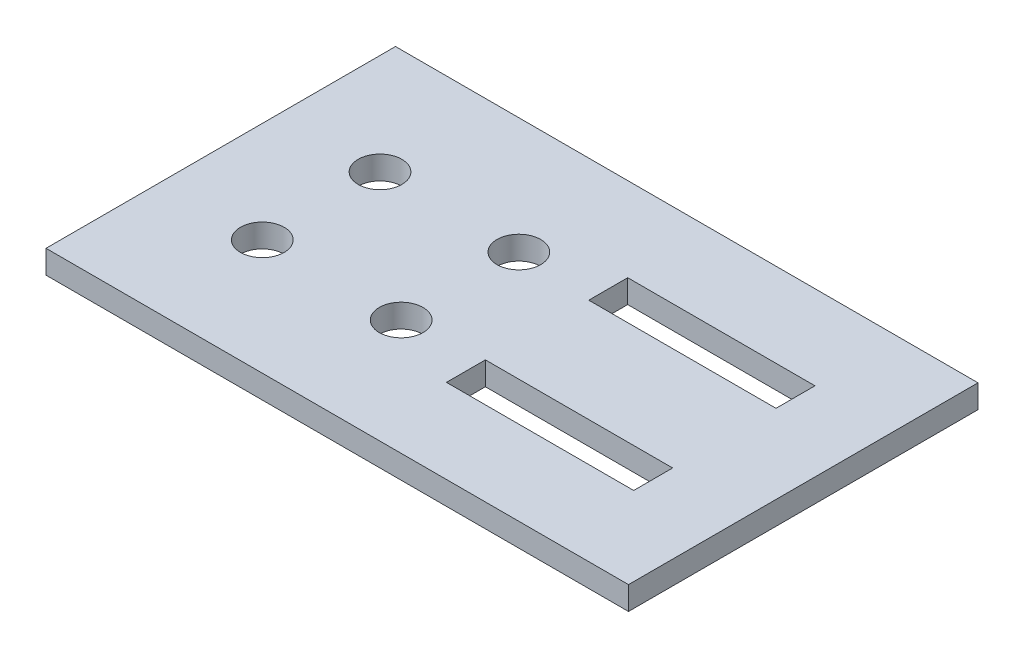
ISO-10303-21;
HEADER;
FILE_DESCRIPTION(('STEP AP214'),'2;1');
FILE_NAME('part.step','',(''),(''),'','','');
FILE_SCHEMA(('AUTOMOTIVE_DESIGN { 1 0 10303 214 1 1 1 1 }'));
ENDSEC;
DATA;
#1=APPLICATION_CONTEXT('core data for automotive mechanical design processes');
#2=APPLICATION_PROTOCOL_DEFINITION('international standard','automotive_design',2000,#1);
#3=PRODUCT_CONTEXT('',#1,'mechanical');
#4=PRODUCT('Part','Part','',(#3));
#5=PRODUCT_RELATED_PRODUCT_CATEGORY('part','',(#4));
#6=PRODUCT_DEFINITION_FORMATION('','',#4);
#7=PRODUCT_DEFINITION_CONTEXT('part definition',#1,'design');
#8=PRODUCT_DEFINITION('design','',#6,#7);
#9=PRODUCT_DEFINITION_SHAPE('','',#8);
#10=(LENGTH_UNIT() NAMED_UNIT(*) SI_UNIT(.MILLI.,.METRE.));
#11=(NAMED_UNIT(*) PLANE_ANGLE_UNIT() SI_UNIT($,.RADIAN.));
#12=(NAMED_UNIT(*) SI_UNIT($,.STERADIAN.) SOLID_ANGLE_UNIT());
#13=UNCERTAINTY_MEASURE_WITH_UNIT(LENGTH_MEASURE(1.E-05),#10,'distance_accuracy_value','');
#14=(GEOMETRIC_REPRESENTATION_CONTEXT(3) GLOBAL_UNCERTAINTY_ASSIGNED_CONTEXT((#13)) GLOBAL_UNIT_ASSIGNED_CONTEXT((#10,
#11,#12)) REPRESENTATION_CONTEXT('',''));
#15=CARTESIAN_POINT('',(0.,0.,0.));
#16=DIRECTION('',(0.,0.,1.));
#17=DIRECTION('',(1.,0.,0.));
#18=AXIS2_PLACEMENT_3D('',#15,#16,#17);
#19=CARTESIAN_POINT('',(-63.5,5.08,-38.1));
#20=DIRECTION('',(1.,0.,0.));
#21=DIRECTION('',(0.,0.,-1.));
#22=AXIS2_PLACEMENT_3D('',#19,#20,#21);
#23=PLANE('',#22);
#24=DIRECTION('',(0.,0.,1.));
#25=VECTOR('',#24,1.);
#26=CARTESIAN_POINT('',(-63.5,0.,-38.1));
#27=LINE('',#26,#25);
#28=CARTESIAN_POINT('',(-63.5,0.,-38.1));
#29=VERTEX_POINT('',#28);
#30=CARTESIAN_POINT('',(-63.5,0.,38.1));
#31=VERTEX_POINT('',#30);
#32=EDGE_CURVE('E195',#29,#31,#27,.T.);
#33=ORIENTED_EDGE('',*,*,#32,.T.);
#34=DIRECTION('',(0.,-1.,0.));
#35=VECTOR('',#34,1.);
#36=CARTESIAN_POINT('',(-63.5,5.08,38.1));
#37=LINE('',#36,#35);
#38=CARTESIAN_POINT('',(-63.5,5.08,38.1));
#39=VERTEX_POINT('',#38);
#40=EDGE_CURVE('E222',#39,#31,#37,.T.);
#41=ORIENTED_EDGE('',*,*,#40,.F.);
#42=DIRECTION('',(0.,0.,1.));
#43=VECTOR('',#42,1.);
#44=CARTESIAN_POINT('',(-63.5,5.08,-38.1));
#45=LINE('',#44,#43);
#46=CARTESIAN_POINT('',(-63.5,5.08,-38.1));
#47=VERTEX_POINT('',#46);
#48=EDGE_CURVE('E196',#47,#39,#45,.T.);
#49=ORIENTED_EDGE('',*,*,#48,.F.);
#50=DIRECTION('',(0.,-1.,0.));
#51=VECTOR('',#50,1.);
#52=CARTESIAN_POINT('',(-63.5,5.08,-38.1));
#53=LINE('',#52,#51);
#54=EDGE_CURVE('E206',#47,#29,#53,.T.);
#55=ORIENTED_EDGE('',*,*,#54,.T.);
#56=EDGE_LOOP('',(#33,#41,#49,#55));
#57=FACE_BOUND('',#56,.T.);
#58=ADVANCED_FACE('F35',(#57),#23,.F.);
#59=CARTESIAN_POINT('',(-63.5,5.08,38.1));
#60=DIRECTION('',(0.,0.,-1.));
#61=DIRECTION('',(-1.,0.,0.));
#62=AXIS2_PLACEMENT_3D('',#59,#60,#61);
#63=PLANE('',#62);
#64=DIRECTION('',(1.,0.,0.));
#65=VECTOR('',#64,1.);
#66=CARTESIAN_POINT('',(-63.5,0.,38.1));
#67=LINE('',#66,#65);
#68=CARTESIAN_POINT('',(63.5,0.,38.1));
#69=VERTEX_POINT('',#68);
#70=EDGE_CURVE('E209',#31,#69,#67,.T.);
#71=ORIENTED_EDGE('',*,*,#70,.T.);
#72=DIRECTION('',(0.,-1.,0.));
#73=VECTOR('',#72,1.);
#74=CARTESIAN_POINT('',(63.5,5.08,38.1));
#75=LINE('',#74,#73);
#76=CARTESIAN_POINT('',(63.5,5.08,38.1));
#77=VERTEX_POINT('',#76);
#78=EDGE_CURVE('E219',#77,#69,#75,.T.);
#79=ORIENTED_EDGE('',*,*,#78,.F.);
#80=DIRECTION('',(1.,0.,0.));
#81=VECTOR('',#80,1.);
#82=CARTESIAN_POINT('',(-63.5,5.08,38.1));
#83=LINE('',#82,#81);
#84=EDGE_CURVE('E199',#39,#77,#83,.T.);
#85=ORIENTED_EDGE('',*,*,#84,.F.);
#86=ORIENTED_EDGE('',*,*,#40,.T.);
#87=EDGE_LOOP('',(#71,#79,#85,#86));
#88=FACE_BOUND('',#87,.T.);
#89=ADVANCED_FACE('F261',(#88),#63,.F.);
#90=CARTESIAN_POINT('',(63.5,5.08,-38.1));
#91=DIRECTION('',(-1.,0.,0.));
#92=DIRECTION('',(0.,0.,1.));
#93=AXIS2_PLACEMENT_3D('',#90,#91,#92);
#94=PLANE('',#93);
#95=DIRECTION('',(0.,0.,-1.));
#96=VECTOR('',#95,1.);
#97=CARTESIAN_POINT('',(63.5,0.,-38.1));
#98=LINE('',#97,#96);
#99=CARTESIAN_POINT('',(63.5,0.,-38.1));
#100=VERTEX_POINT('',#99);
#101=EDGE_CURVE('E211',#69,#100,#98,.T.);
#102=ORIENTED_EDGE('',*,*,#101,.T.);
#103=DIRECTION('',(0.,-1.,0.));
#104=VECTOR('',#103,1.);
#105=CARTESIAN_POINT('',(63.5,5.08,-38.1));
#106=LINE('',#105,#104);
#107=CARTESIAN_POINT('',(63.5,5.08,-38.1));
#108=VERTEX_POINT('',#107);
#109=EDGE_CURVE('E216',#108,#100,#106,.T.);
#110=ORIENTED_EDGE('',*,*,#109,.F.);
#111=DIRECTION('',(0.,0.,-1.));
#112=VECTOR('',#111,1.);
#113=CARTESIAN_POINT('',(63.5,5.08,-38.1));
#114=LINE('',#113,#112);
#115=EDGE_CURVE('E202',#77,#108,#114,.T.);
#116=ORIENTED_EDGE('',*,*,#115,.F.);
#117=ORIENTED_EDGE('',*,*,#78,.T.);
#118=EDGE_LOOP('',(#102,#110,#116,#117));
#119=FACE_BOUND('',#118,.T.);
#120=ADVANCED_FACE('F266',(#119),#94,.F.);
#121=CARTESIAN_POINT('',(-63.5,5.08,-38.1));
#122=DIRECTION('',(0.,0.,1.));
#123=DIRECTION('',(1.,0.,0.));
#124=AXIS2_PLACEMENT_3D('',#121,#122,#123);
#125=PLANE('',#124);
#126=DIRECTION('',(-1.,0.,0.));
#127=VECTOR('',#126,1.);
#128=CARTESIAN_POINT('',(-63.5,0.,-38.1));
#129=LINE('',#128,#127);
#130=EDGE_CURVE('E200',#100,#29,#129,.T.);
#131=ORIENTED_EDGE('',*,*,#130,.T.);
#132=ORIENTED_EDGE('',*,*,#54,.F.);
#133=DIRECTION('',(-1.,0.,0.));
#134=VECTOR('',#133,1.);
#135=CARTESIAN_POINT('',(-63.5,5.08,-38.1));
#136=LINE('',#135,#134);
#137=EDGE_CURVE('E204',#108,#47,#136,.T.);
#138=ORIENTED_EDGE('',*,*,#137,.F.);
#139=ORIENTED_EDGE('',*,*,#109,.T.);
#140=EDGE_LOOP('',(#131,#132,#138,#139));
#141=FACE_BOUND('',#140,.T.);
#142=ADVANCED_FACE('F281',(#141),#125,.F.);
#143=CARTESIAN_POINT('',(0.,5.08,0.));
#144=DIRECTION('',(0.,1.,0.));
#145=DIRECTION('',(0.,0.,1.));
#146=AXIS2_PLACEMENT_3D('',#143,#144,#145);
#147=PLANE('',#146);
#148=DIRECTION('',(0.,0.,-1.));
#149=VECTOR('',#148,1.);
#150=CARTESIAN_POINT('',(46.2933079550965,5.08,-11.2677187461334));
#151=LINE('',#150,#149);
#152=CARTESIAN_POINT('',(46.2933079550965,5.08,-11.2677187461334));
#153=VERTEX_POINT('',#152);
#154=CARTESIAN_POINT('',(46.2933079550965,5.08,-19.76095972678));
#155=VERTEX_POINT('',#154);
#156=EDGE_CURVE('E49',#153,#155,#151,.T.);
#157=ORIENTED_EDGE('',*,*,#156,.F.);
#158=DIRECTION('',(1.,0.,0.));
#159=VECTOR('',#158,1.);
#160=CARTESIAN_POINT('',(46.2933079550965,5.08,-11.2677187461334));
#161=LINE('',#160,#159);
#162=CARTESIAN_POINT('',(5.46809257160419,5.08,-11.2677187461334));
#163=VERTEX_POINT('',#162);
#164=EDGE_CURVE('E142',#163,#153,#161,.T.);
#165=ORIENTED_EDGE('',*,*,#164,.F.);
#166=DIRECTION('',(0.,0.,1.));
#167=VECTOR('',#166,1.);
#168=CARTESIAN_POINT('',(5.46809257160419,5.08,-11.2677187461334));
#169=LINE('',#168,#167);
#170=CARTESIAN_POINT('',(5.46809257160419,5.08,-19.76095972678));
#171=VERTEX_POINT('',#170);
#172=EDGE_CURVE('E126',#171,#163,#169,.T.);
#173=ORIENTED_EDGE('',*,*,#172,.F.);
#174=DIRECTION('',(-1.,0.,0.));
#175=VECTOR('',#174,1.);
#176=CARTESIAN_POINT('',(46.2933079550965,5.08,-19.76095972678));
#177=LINE('',#176,#175);
#178=EDGE_CURVE('E135',#155,#171,#177,.T.);
#179=ORIENTED_EDGE('',*,*,#178,.F.);
#180=EDGE_LOOP('',(#157,#165,#173,#179));
#181=FACE_BOUND('',#180,.T.);
#182=DIRECTION('',(0.,0.,1.));
#183=VECTOR('',#182,1.);
#184=CARTESIAN_POINT('',(5.46809257160419,5.08,11.2677187461334));
#185=LINE('',#184,#183);
#186=CARTESIAN_POINT('',(5.46809257160419,5.08,11.2677187461334));
#187=VERTEX_POINT('',#186);
#188=CARTESIAN_POINT('',(5.46809257160419,5.08,19.76095972678));
#189=VERTEX_POINT('',#188);
#190=EDGE_CURVE('E149',#187,#189,#185,.T.);
#191=ORIENTED_EDGE('',*,*,#190,.F.);
#192=DIRECTION('',(-1.,0.,0.));
#193=VECTOR('',#192,1.);
#194=CARTESIAN_POINT('',(46.2933079550965,5.08,11.2677187461334));
#195=LINE('',#194,#193);
#196=CARTESIAN_POINT('',(46.2933079550965,5.08,11.2677187461334));
#197=VERTEX_POINT('',#196);
#198=EDGE_CURVE('E159',#197,#187,#195,.T.);
#199=ORIENTED_EDGE('',*,*,#198,.F.);
#200=DIRECTION('',(0.,0.,-1.));
#201=VECTOR('',#200,1.);
#202=CARTESIAN_POINT('',(46.2933079550965,5.08,11.2677187461334));
#203=LINE('',#202,#201);
#204=CARTESIAN_POINT('',(46.2933079550965,5.08,19.76095972678));
#205=VERTEX_POINT('',#204);
#206=EDGE_CURVE('E156',#205,#197,#203,.T.);
#207=ORIENTED_EDGE('',*,*,#206,.F.);
#208=DIRECTION('',(1.,0.,0.));
#209=VECTOR('',#208,1.);
#210=CARTESIAN_POINT('',(46.2933079550965,5.08,19.76095972678));
#211=LINE('',#210,#209);
#212=EDGE_CURVE('E153',#189,#205,#211,.T.);
#213=ORIENTED_EDGE('',*,*,#212,.F.);
#214=EDGE_LOOP('',(#191,#199,#207,#213));
#215=FACE_BOUND('',#214,.T.);
#216=CARTESIAN_POINT('',(-41.5142040447299,5.08,-12.7376611280216));
#217=DIRECTION('',(0.,1.,0.));
#218=DIRECTION('',(0.,0.,1.));
#219=AXIS2_PLACEMENT_3D('',#216,#217,#218);
#220=CIRCLE('',#219,4.76249999999999);
#221=CARTESIAN_POINT('',(-41.5142040447299,5.08,-7.97516112802161));
#222=VERTEX_POINT('',#221);
#223=EDGE_CURVE('E165',#222,#222,#220,.T.);
#224=ORIENTED_EDGE('',*,*,#223,.F.);
#225=EDGE_LOOP('',(#224));
#226=FACE_BOUND('',#225,.T.);
#227=CARTESIAN_POINT('',(-41.5142040447299,5.08,12.9253103480041));
#228=DIRECTION('',(0.,1.,0.));
#229=DIRECTION('',(0.,0.,1.));
#230=AXIS2_PLACEMENT_3D('',#227,#228,#229);
#231=CIRCLE('',#230,4.76249999999999);
#232=CARTESIAN_POINT('',(-41.5142040447299,5.08,17.687810348004));
#233=VERTEX_POINT('',#232);
#234=EDGE_CURVE('E177',#233,#233,#231,.T.);
#235=ORIENTED_EDGE('',*,*,#234,.F.);
#236=EDGE_LOOP('',(#235));
#237=FACE_BOUND('',#236,.T.);
#238=CARTESIAN_POINT('',(-11.2427493754258,5.08,12.9253103480041));
#239=DIRECTION('',(0.,1.,0.));
#240=DIRECTION('',(0.,0.,1.));
#241=AXIS2_PLACEMENT_3D('',#238,#239,#240);
#242=CIRCLE('',#241,4.76249999999999);
#243=CARTESIAN_POINT('',(-11.2427493754258,5.08,17.687810348004));
#244=VERTEX_POINT('',#243);
#245=EDGE_CURVE('E183',#244,#244,#242,.T.);
#246=ORIENTED_EDGE('',*,*,#245,.F.);
#247=EDGE_LOOP('',(#246));
#248=FACE_BOUND('',#247,.T.);
#249=CARTESIAN_POINT('',(-11.2427493754258,5.08,-12.7376611280216));
#250=DIRECTION('',(0.,1.,0.));
#251=DIRECTION('',(0.,0.,1.));
#252=AXIS2_PLACEMENT_3D('',#249,#250,#251);
#253=CIRCLE('',#252,4.76249999999999);
#254=CARTESIAN_POINT('',(-11.2427493754258,5.08,-7.97516112802161));
#255=VERTEX_POINT('',#254);
#256=EDGE_CURVE('E189',#255,#255,#253,.T.);
#257=ORIENTED_EDGE('',*,*,#256,.F.);
#258=EDGE_LOOP('',(#257));
#259=FACE_BOUND('',#258,.T.);
#260=ORIENTED_EDGE('',*,*,#48,.T.);
#261=ORIENTED_EDGE('',*,*,#84,.T.);
#262=ORIENTED_EDGE('',*,*,#115,.T.);
#263=ORIENTED_EDGE('',*,*,#137,.T.);
#264=EDGE_LOOP('',(#260,#261,#262,#263));
#265=FACE_BOUND('',#264,.T.);
#266=ADVANCED_FACE('F139',(#181,#215,#226,#237,#248,#259,#265),#147,.T.);
#267=CARTESIAN_POINT('',(0.,0.,0.));
#268=DIRECTION('',(0.,1.,0.));
#269=DIRECTION('',(0.,0.,1.));
#270=AXIS2_PLACEMENT_3D('',#267,#268,#269);
#271=PLANE('',#270);
#272=DIRECTION('',(1.,0.,0.));
#273=VECTOR('',#272,1.);
#274=CARTESIAN_POINT('',(0.,0.,-11.2677187461334));
#275=LINE('',#274,#273);
#276=CARTESIAN_POINT('',(5.46809257160419,0.,-11.2677187461334));
#277=VERTEX_POINT('',#276);
#278=CARTESIAN_POINT('',(46.2933079550965,0.,-11.2677187461334));
#279=VERTEX_POINT('',#278);
#280=EDGE_CURVE('E42',#277,#279,#275,.T.);
#281=ORIENTED_EDGE('',*,*,#280,.T.);
#282=DIRECTION('',(0.,0.,-1.));
#283=VECTOR('',#282,1.);
#284=CARTESIAN_POINT('',(46.2933079550965,0.,0.));
#285=LINE('',#284,#283);
#286=CARTESIAN_POINT('',(46.2933079550965,0.,-19.76095972678));
#287=VERTEX_POINT('',#286);
#288=EDGE_CURVE('E11',#279,#287,#285,.T.);
#289=ORIENTED_EDGE('',*,*,#288,.T.);
#290=DIRECTION('',(-1.,0.,0.));
#291=VECTOR('',#290,1.);
#292=CARTESIAN_POINT('',(0.,0.,-19.7609597267801));
#293=LINE('',#292,#291);
#294=CARTESIAN_POINT('',(5.46809257160419,0.,-19.76095972678));
#295=VERTEX_POINT('',#294);
#296=EDGE_CURVE('E237',#287,#295,#293,.T.);
#297=ORIENTED_EDGE('',*,*,#296,.T.);
#298=DIRECTION('',(0.,0.,1.));
#299=VECTOR('',#298,1.);
#300=CARTESIAN_POINT('',(5.46809257160419,0.,0.));
#301=LINE('',#300,#299);
#302=EDGE_CURVE('E129',#295,#277,#301,.T.);
#303=ORIENTED_EDGE('',*,*,#302,.T.);
#304=EDGE_LOOP('',(#281,#289,#297,#303));
#305=FACE_BOUND('',#304,.T.);
#306=DIRECTION('',(-1.,0.,0.));
#307=VECTOR('',#306,1.);
#308=CARTESIAN_POINT('',(0.,0.,11.2677187461334));
#309=LINE('',#308,#307);
#310=CARTESIAN_POINT('',(46.2933079550965,0.,11.2677187461334));
#311=VERTEX_POINT('',#310);
#312=CARTESIAN_POINT('',(5.46809257160419,0.,11.2677187461334));
#313=VERTEX_POINT('',#312);
#314=EDGE_CURVE('E231',#311,#313,#309,.T.);
#315=ORIENTED_EDGE('',*,*,#314,.T.);
#316=DIRECTION('',(0.,0.,1.));
#317=VECTOR('',#316,1.);
#318=CARTESIAN_POINT('',(5.46809257160419,0.,0.));
#319=LINE('',#318,#317);
#320=CARTESIAN_POINT('',(5.46809257160419,0.,19.76095972678));
#321=VERTEX_POINT('',#320);
#322=EDGE_CURVE('E234',#313,#321,#319,.T.);
#323=ORIENTED_EDGE('',*,*,#322,.T.);
#324=DIRECTION('',(1.,0.,0.));
#325=VECTOR('',#324,1.);
#326=CARTESIAN_POINT('',(0.,0.,19.76095972678));
#327=LINE('',#326,#325);
#328=CARTESIAN_POINT('',(46.2933079550965,0.,19.76095972678));
#329=VERTEX_POINT('',#328);
#330=EDGE_CURVE('E225',#321,#329,#327,.T.);
#331=ORIENTED_EDGE('',*,*,#330,.T.);
#332=DIRECTION('',(0.,0.,-1.));
#333=VECTOR('',#332,1.);
#334=CARTESIAN_POINT('',(46.2933079550965,0.,0.));
#335=LINE('',#334,#333);
#336=EDGE_CURVE('E228',#329,#311,#335,.T.);
#337=ORIENTED_EDGE('',*,*,#336,.T.);
#338=EDGE_LOOP('',(#315,#323,#331,#337));
#339=FACE_BOUND('',#338,.T.);
#340=CARTESIAN_POINT('',(-41.5142040447299,0.,-12.7376611280216));
#341=DIRECTION('',(0.,1.,0.));
#342=DIRECTION('',(0.,0.,1.));
#343=AXIS2_PLACEMENT_3D('',#340,#341,#342);
#344=CIRCLE('',#343,4.7625);
#345=CARTESIAN_POINT('',(-41.5142040447299,0.,-7.9751611280216));
#346=VERTEX_POINT('',#345);
#347=EDGE_CURVE('E174',#346,#346,#344,.T.);
#348=ORIENTED_EDGE('',*,*,#347,.T.);
#349=EDGE_LOOP('',(#348));
#350=FACE_BOUND('',#349,.T.);
#351=CARTESIAN_POINT('',(-41.5142040447299,0.,12.9253103480041));
#352=DIRECTION('',(0.,1.,0.));
#353=DIRECTION('',(0.,0.,1.));
#354=AXIS2_PLACEMENT_3D('',#351,#352,#353);
#355=CIRCLE('',#354,4.7625);
#356=CARTESIAN_POINT('',(-41.5142040447299,0.,17.687810348004));
#357=VERTEX_POINT('',#356);
#358=EDGE_CURVE('E180',#357,#357,#355,.T.);
#359=ORIENTED_EDGE('',*,*,#358,.T.);
#360=EDGE_LOOP('',(#359));
#361=FACE_BOUND('',#360,.T.);
#362=CARTESIAN_POINT('',(-11.2427493754258,0.,12.9253103480041));
#363=DIRECTION('',(0.,1.,0.));
#364=DIRECTION('',(0.,0.,1.));
#365=AXIS2_PLACEMENT_3D('',#362,#363,#364);
#366=CIRCLE('',#365,4.7625);
#367=CARTESIAN_POINT('',(-11.2427493754258,0.,17.687810348004));
#368=VERTEX_POINT('',#367);
#369=EDGE_CURVE('E186',#368,#368,#366,.T.);
#370=ORIENTED_EDGE('',*,*,#369,.T.);
#371=EDGE_LOOP('',(#370));
#372=FACE_BOUND('',#371,.T.);
#373=CARTESIAN_POINT('',(-11.2427493754258,0.,-12.7376611280216));
#374=DIRECTION('',(0.,1.,0.));
#375=DIRECTION('',(0.,0.,1.));
#376=AXIS2_PLACEMENT_3D('',#373,#374,#375);
#377=CIRCLE('',#376,4.7625);
#378=CARTESIAN_POINT('',(-11.2427493754258,0.,-7.9751611280216));
#379=VERTEX_POINT('',#378);
#380=EDGE_CURVE('E192',#379,#379,#377,.T.);
#381=ORIENTED_EDGE('',*,*,#380,.T.);
#382=EDGE_LOOP('',(#381));
#383=FACE_BOUND('',#382,.T.);
#384=ORIENTED_EDGE('',*,*,#32,.F.);
#385=ORIENTED_EDGE('',*,*,#130,.F.);
#386=ORIENTED_EDGE('',*,*,#101,.F.);
#387=ORIENTED_EDGE('',*,*,#70,.F.);
#388=EDGE_LOOP('',(#384,#385,#386,#387));
#389=FACE_BOUND('',#388,.T.);
#390=ADVANCED_FACE('F241',(#305,#339,#350,#361,#372,#383,#389),#271,.F.);
#391=CARTESIAN_POINT('',(-11.2427493754258,5.08,-12.7376611280216));
#392=DIRECTION('',(0.,1.,0.));
#393=DIRECTION('',(0.,0.,1.));
#394=AXIS2_PLACEMENT_3D('',#391,#392,#393);
#395=CYLINDRICAL_SURFACE('',#394,4.76249999999999);
#396=ORIENTED_EDGE('',*,*,#380,.F.);
#397=EDGE_LOOP('',(#396));
#398=FACE_BOUND('',#397,.T.);
#399=ORIENTED_EDGE('',*,*,#256,.T.);
#400=EDGE_LOOP('',(#399));
#401=FACE_BOUND('',#400,.T.);
#402=ADVANCED_FACE('F292',(#398,#401),#395,.F.);
#403=CARTESIAN_POINT('',(-11.2427493754258,5.08,12.9253103480041));
#404=DIRECTION('',(0.,1.,0.));
#405=DIRECTION('',(0.,0.,1.));
#406=AXIS2_PLACEMENT_3D('',#403,#404,#405);
#407=CYLINDRICAL_SURFACE('',#406,4.76249999999999);
#408=ORIENTED_EDGE('',*,*,#369,.F.);
#409=EDGE_LOOP('',(#408));
#410=FACE_BOUND('',#409,.T.);
#411=ORIENTED_EDGE('',*,*,#245,.T.);
#412=EDGE_LOOP('',(#411));
#413=FACE_BOUND('',#412,.T.);
#414=ADVANCED_FACE('F297',(#410,#413),#407,.F.);
#415=CARTESIAN_POINT('',(-41.5142040447299,5.08,12.9253103480041));
#416=DIRECTION('',(0.,1.,0.));
#417=DIRECTION('',(0.,0.,1.));
#418=AXIS2_PLACEMENT_3D('',#415,#416,#417);
#419=CYLINDRICAL_SURFACE('',#418,4.76249999999999);
#420=ORIENTED_EDGE('',*,*,#358,.F.);
#421=EDGE_LOOP('',(#420));
#422=FACE_BOUND('',#421,.T.);
#423=ORIENTED_EDGE('',*,*,#234,.T.);
#424=EDGE_LOOP('',(#423));
#425=FACE_BOUND('',#424,.T.);
#426=ADVANCED_FACE('F301',(#422,#425),#419,.F.);
#427=CARTESIAN_POINT('',(-41.5142040447299,5.08,-12.7376611280216));
#428=DIRECTION('',(0.,1.,0.));
#429=DIRECTION('',(0.,0.,1.));
#430=AXIS2_PLACEMENT_3D('',#427,#428,#429);
#431=CYLINDRICAL_SURFACE('',#430,4.76249999999999);
#432=ORIENTED_EDGE('',*,*,#347,.F.);
#433=EDGE_LOOP('',(#432));
#434=FACE_BOUND('',#433,.T.);
#435=ORIENTED_EDGE('',*,*,#223,.T.);
#436=EDGE_LOOP('',(#435));
#437=FACE_BOUND('',#436,.T.);
#438=ADVANCED_FACE('F305',(#434,#437),#431,.F.);
#439=CARTESIAN_POINT('',(5.46809257160419,-60.96,11.2677187461334));
#440=DIRECTION('',(-1.,0.,0.));
#441=DIRECTION('',(0.,0.,1.));
#442=AXIS2_PLACEMENT_3D('',#439,#440,#441);
#443=PLANE('',#442);
#444=DIRECTION('',(0.,1.,0.));
#445=VECTOR('',#444,1.);
#446=CARTESIAN_POINT('',(5.46809257160419,-60.96,11.2677187461334));
#447=LINE('',#446,#445);
#448=EDGE_CURVE('E163',#313,#187,#447,.T.);
#449=ORIENTED_EDGE('',*,*,#448,.T.);
#450=ORIENTED_EDGE('',*,*,#190,.T.);
#451=DIRECTION('',(0.,1.,0.));
#452=VECTOR('',#451,1.);
#453=CARTESIAN_POINT('',(5.46809257160419,-60.96,19.76095972678));
#454=LINE('',#453,#452);
#455=EDGE_CURVE('E162',#321,#189,#454,.T.);
#456=ORIENTED_EDGE('',*,*,#455,.F.);
#457=ORIENTED_EDGE('',*,*,#322,.F.);
#458=EDGE_LOOP('',(#449,#450,#456,#457));
#459=FACE_BOUND('',#458,.T.);
#460=ADVANCED_FACE('F309',(#459),#443,.F.);
#461=CARTESIAN_POINT('',(46.2933079550965,-60.96,11.2677187461334));
#462=DIRECTION('',(0.,0.,-1.));
#463=DIRECTION('',(-1.,0.,0.));
#464=AXIS2_PLACEMENT_3D('',#461,#462,#463);
#465=PLANE('',#464);
#466=DIRECTION('',(0.,1.,0.));
#467=VECTOR('',#466,1.);
#468=CARTESIAN_POINT('',(46.2933079550965,-60.96,11.2677187461334));
#469=LINE('',#468,#467);
#470=EDGE_CURVE('E166',#311,#197,#469,.T.);
#471=ORIENTED_EDGE('',*,*,#470,.T.);
#472=ORIENTED_EDGE('',*,*,#198,.T.);
#473=ORIENTED_EDGE('',*,*,#448,.F.);
#474=ORIENTED_EDGE('',*,*,#314,.F.);
#475=EDGE_LOOP('',(#471,#472,#473,#474));
#476=FACE_BOUND('',#475,.T.);
#477=ADVANCED_FACE('F312',(#476),#465,.F.);
#478=CARTESIAN_POINT('',(46.2933079550965,-60.96,11.2677187461334));
#479=DIRECTION('',(1.,0.,0.));
#480=DIRECTION('',(0.,0.,-1.));
#481=AXIS2_PLACEMENT_3D('',#478,#479,#480);
#482=PLANE('',#481);
#483=DIRECTION('',(0.,1.,0.));
#484=VECTOR('',#483,1.);
#485=CARTESIAN_POINT('',(46.2933079550965,-60.96,19.76095972678));
#486=LINE('',#485,#484);
#487=EDGE_CURVE('E168',#329,#205,#486,.T.);
#488=ORIENTED_EDGE('',*,*,#487,.T.);
#489=ORIENTED_EDGE('',*,*,#206,.T.);
#490=ORIENTED_EDGE('',*,*,#470,.F.);
#491=ORIENTED_EDGE('',*,*,#336,.F.);
#492=EDGE_LOOP('',(#488,#489,#490,#491));
#493=FACE_BOUND('',#492,.T.);
#494=ADVANCED_FACE('F255',(#493),#482,.F.);
#495=CARTESIAN_POINT('',(46.2933079550965,-60.96,19.76095972678));
#496=DIRECTION('',(0.,0.,1.));
#497=DIRECTION('',(1.,0.,0.));
#498=AXIS2_PLACEMENT_3D('',#495,#496,#497);
#499=PLANE('',#498);
#500=ORIENTED_EDGE('',*,*,#455,.T.);
#501=ORIENTED_EDGE('',*,*,#212,.T.);
#502=ORIENTED_EDGE('',*,*,#487,.F.);
#503=ORIENTED_EDGE('',*,*,#330,.F.);
#504=EDGE_LOOP('',(#500,#501,#502,#503));
#505=FACE_BOUND('',#504,.T.);
#506=ADVANCED_FACE('F248',(#505),#499,.F.);
#507=CARTESIAN_POINT('',(46.2933079550965,-60.96,-11.2677187461334));
#508=DIRECTION('',(1.,0.,0.));
#509=DIRECTION('',(0.,0.,-1.));
#510=AXIS2_PLACEMENT_3D('',#507,#508,#509);
#511=PLANE('',#510);
#512=DIRECTION('',(0.,1.,0.));
#513=VECTOR('',#512,1.);
#514=CARTESIAN_POINT('',(46.2933079550965,-60.96,-11.2677187461334));
#515=LINE('',#514,#513);
#516=EDGE_CURVE('E147',#279,#153,#515,.T.);
#517=ORIENTED_EDGE('',*,*,#516,.T.);
#518=ORIENTED_EDGE('',*,*,#156,.T.);
#519=DIRECTION('',(0.,1.,0.));
#520=VECTOR('',#519,1.);
#521=CARTESIAN_POINT('',(46.2933079550965,-60.96,-19.76095972678));
#522=LINE('',#521,#520);
#523=EDGE_CURVE('E132',#287,#155,#522,.T.);
#524=ORIENTED_EDGE('',*,*,#523,.F.);
#525=ORIENTED_EDGE('',*,*,#288,.F.);
#526=EDGE_LOOP('',(#517,#518,#524,#525));
#527=FACE_BOUND('',#526,.T.);
#528=ADVANCED_FACE('F246',(#527),#511,.F.);
#529=CARTESIAN_POINT('',(46.2933079550965,-60.96,-11.2677187461334));
#530=DIRECTION('',(0.,0.,1.));
#531=DIRECTION('',(1.,0.,0.));
#532=AXIS2_PLACEMENT_3D('',#529,#530,#531);
#533=PLANE('',#532);
#534=DIRECTION('',(0.,1.,0.));
#535=VECTOR('',#534,1.);
#536=CARTESIAN_POINT('',(5.46809257160419,-60.96,-11.2677187461334));
#537=LINE('',#536,#535);
#538=EDGE_CURVE('E131',#277,#163,#537,.T.);
#539=ORIENTED_EDGE('',*,*,#538,.T.);
#540=ORIENTED_EDGE('',*,*,#164,.T.);
#541=ORIENTED_EDGE('',*,*,#516,.F.);
#542=ORIENTED_EDGE('',*,*,#280,.F.);
#543=EDGE_LOOP('',(#539,#540,#541,#542));
#544=FACE_BOUND('',#543,.T.);
#545=ADVANCED_FACE('F245',(#544),#533,.F.);
#546=CARTESIAN_POINT('',(5.46809257160419,-60.96,-11.2677187461334));
#547=DIRECTION('',(-1.,0.,0.));
#548=DIRECTION('',(0.,0.,1.));
#549=AXIS2_PLACEMENT_3D('',#546,#547,#548);
#550=PLANE('',#549);
#551=DIRECTION('',(0.,1.,0.));
#552=VECTOR('',#551,1.);
#553=CARTESIAN_POINT('',(5.46809257160419,-60.96,-19.76095972678));
#554=LINE('',#553,#552);
#555=EDGE_CURVE('E57',#295,#171,#554,.T.);
#556=ORIENTED_EDGE('',*,*,#555,.T.);
#557=ORIENTED_EDGE('',*,*,#172,.T.);
#558=ORIENTED_EDGE('',*,*,#538,.F.);
#559=ORIENTED_EDGE('',*,*,#302,.F.);
#560=EDGE_LOOP('',(#556,#557,#558,#559));
#561=FACE_BOUND('',#560,.T.);
#562=ADVANCED_FACE('F123',(#561),#550,.F.);
#563=CARTESIAN_POINT('',(46.2933079550965,-60.96,-19.76095972678));
#564=DIRECTION('',(0.,0.,-1.));
#565=DIRECTION('',(-1.,0.,0.));
#566=AXIS2_PLACEMENT_3D('',#563,#564,#565);
#567=PLANE('',#566);
#568=ORIENTED_EDGE('',*,*,#523,.T.);
#569=ORIENTED_EDGE('',*,*,#178,.T.);
#570=ORIENTED_EDGE('',*,*,#555,.F.);
#571=ORIENTED_EDGE('',*,*,#296,.F.);
#572=EDGE_LOOP('',(#568,#569,#570,#571));
#573=FACE_BOUND('',#572,.T.);
#574=ADVANCED_FACE('F136',(#573),#567,.F.);
#575=CLOSED_SHELL('',(#58,#89,#120,#142,#266,#390,#402,#414,#426,#438,#460,#477,#494,#506,#528,
#545,#562,#574));
#576=MANIFOLD_SOLID_BREP('B2',#575);
#577=ADVANCED_BREP_SHAPE_REPRESENTATION('',(#18,#576),#14);
#578=SHAPE_DEFINITION_REPRESENTATION(#9,#577);
ENDSEC;
END-ISO-10303-21;
